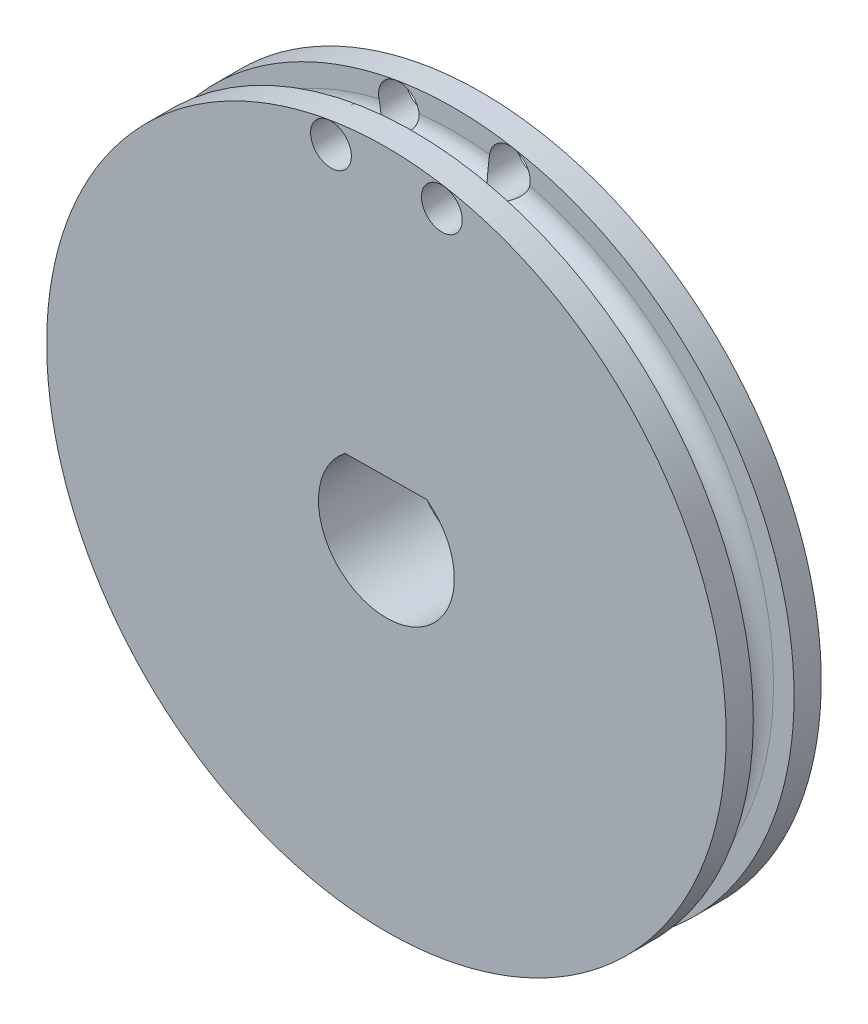
ISO-10303-21;
HEADER;
FILE_DESCRIPTION(('STEP AP214'),'2;1');
FILE_NAME('part.step','',(''),(''),'','','');
FILE_SCHEMA(('AUTOMOTIVE_DESIGN { 1 0 10303 214 1 1 1 1 }'));
ENDSEC;
DATA;
#1=APPLICATION_CONTEXT('core data for automotive mechanical design processes');
#2=APPLICATION_PROTOCOL_DEFINITION('international standard','automotive_design',2000,#1);
#3=PRODUCT_CONTEXT('',#1,'mechanical');
#4=PRODUCT('Part','Part','',(#3));
#5=PRODUCT_RELATED_PRODUCT_CATEGORY('part','',(#4));
#6=PRODUCT_DEFINITION_FORMATION('','',#4);
#7=PRODUCT_DEFINITION_CONTEXT('part definition',#1,'design');
#8=PRODUCT_DEFINITION('design','',#6,#7);
#9=PRODUCT_DEFINITION_SHAPE('','',#8);
#10=(LENGTH_UNIT() NAMED_UNIT(*) SI_UNIT(.MILLI.,.METRE.));
#11=(NAMED_UNIT(*) PLANE_ANGLE_UNIT() SI_UNIT($,.RADIAN.));
#12=(NAMED_UNIT(*) SI_UNIT($,.STERADIAN.) SOLID_ANGLE_UNIT());
#13=UNCERTAINTY_MEASURE_WITH_UNIT(LENGTH_MEASURE(1.E-05),#10,'distance_accuracy_value','');
#14=(GEOMETRIC_REPRESENTATION_CONTEXT(3) GLOBAL_UNCERTAINTY_ASSIGNED_CONTEXT((#13)) GLOBAL_UNIT_ASSIGNED_CONTEXT((#10,
#11,#12)) REPRESENTATION_CONTEXT('',''));
#15=CARTESIAN_POINT('',(0.,0.,0.));
#16=DIRECTION('',(0.,0.,1.));
#17=DIRECTION('',(1.,0.,0.));
#18=AXIS2_PLACEMENT_3D('',#15,#16,#17);
#19=CARTESIAN_POINT('',(0.,0.,0.072036914945138));
#20=DIRECTION('',(0.,0.,1.));
#21=DIRECTION('',(1.,0.,0.));
#22=AXIS2_PLACEMENT_3D('',#19,#20,#21);
#23=TOROIDAL_SURFACE('',#22,23.49,1.5);
#24=CARTESIAN_POINT('',(0.,0.,-1.42796308505486));
#25=DIRECTION('',(0.,0.,1.));
#26=DIRECTION('',(1.,0.,0.));
#27=AXIS2_PLACEMENT_3D('',#24,#25,#26);
#28=CIRCLE('',#27,23.49);
#29=CARTESIAN_POINT('',(-5.54713769197944,22.8256295296805,-1.42796308505486));
#30=VERTEX_POINT('',#29);
#31=CARTESIAN_POINT('',(5.54713769197964,22.8256295296813,-1.42796308505486));
#32=VERTEX_POINT('',#31);
#33=EDGE_CURVE('E109',#30,#32,#28,.T.);
#34=ORIENTED_EDGE('',*,*,#33,.T.);
#35=CARTESIAN_POINT('',(5.53587727955703,23.4902,-1.28282523331475));
#36=CARTESIAN_POINT('',(5.54296988954583,23.4612577675337,-1.29543508731334));
#37=CARTESIAN_POINT('',(5.54926513448115,23.4318414872527,-1.30739075382882));
#38=CARTESIAN_POINT('',(5.56014559001883,23.3721291733829,-1.3298635084857));
#39=CARTESIAN_POINT('',(5.56472940271165,23.34183244231,-1.34037941620202));
#40=CARTESIAN_POINT('',(5.57574755035601,23.2496067879141,-1.36960251723841));
#41=CARTESIAN_POINT('',(5.57940320750865,23.1865225117294,-1.38590534535933));
#42=CARTESIAN_POINT('',(5.57851359601544,23.0585896128547,-1.4109998918205));
#43=CARTESIAN_POINT('',(5.57392826223024,22.9937338883876,-1.41975460722039));
#44=CARTESIAN_POINT('',(5.55621707533469,22.8647342078331,-1.42882508482921));
#45=CARTESIAN_POINT('',(5.54311302305261,22.8005888587861,-1.42916230227391));
#46=CARTESIAN_POINT('',(5.50999335384375,22.6793411032209,-1.42158781258805));
#47=CARTESIAN_POINT('',(5.49050852649365,22.62205642535,-1.41423567121649));
#48=CARTESIAN_POINT('',(5.44535854027114,22.5113363926003,-1.39257744338744));
#49=CARTESIAN_POINT('',(5.41968752106894,22.4579047505302,-1.37826474986163));
#50=CARTESIAN_POINT('',(5.36267660035387,22.3548609879855,-1.34312765788525));
#51=CARTESIAN_POINT('',(5.33122514745139,22.3053577553524,-1.32216788666088));
#52=CARTESIAN_POINT('',(5.26426826944067,22.212029737362,-1.27489974194297));
#53=CARTESIAN_POINT('',(5.22876187285828,22.1682063181529,-1.24859008555276));
#54=CARTESIAN_POINT('',(5.13498252900141,22.0644641762039,-1.17641006770837));
#55=CARTESIAN_POINT('',(5.07466933075333,22.008431310042,-1.12759226735275));
#56=CARTESIAN_POINT('',(4.94984946741378,21.9092042260006,-1.02273167910773));
#57=CARTESIAN_POINT('',(4.88533179615433,21.8660455007917,-0.966669517309491));
#58=CARTESIAN_POINT('',(4.72690271071568,21.7760738682272,-0.825326797982623));
#59=CARTESIAN_POINT('',(4.63188124646892,21.7351465489062,-0.73755929116025));
#60=CARTESIAN_POINT('',(4.44079697214819,21.6739643568223,-0.556346515323248));
#61=CARTESIAN_POINT('',(4.34473341788815,21.6537253957179,-0.462896934592875));
#62=CARTESIAN_POINT('',(4.17727404012214,21.6346127931683,-0.29661562026875));
#63=CARTESIAN_POINT('',(4.10566591269968,21.6316868091401,-0.224414824434202));
#64=CARTESIAN_POINT('',(3.96368171012444,21.6358913289204,-0.0793042813436796));
#65=CARTESIAN_POINT('',(3.89330361838324,21.6430034211187,-0.00639607500957681));
#66=CARTESIAN_POINT('',(3.82206016996136,21.655302143156,0.0683257341572568));
#67=CARTESIAN_POINT('',(3.82029150239289,21.6556107342101,0.0701813419917548));
#68=CARTESIAN_POINT('',(3.81852342689566,21.6559224887385,0.072036914945138));
#69=B_SPLINE_CURVE_WITH_KNOTS('',3,(#35,#36,#37,#38,#39,#40,#41,#42,#43,#44,#45,#46,#47,#48,#49,
#50,#51,#52,#53,#54,#55,#56,#57,#58,#59,#60,#61,#62,#63,#64,#65,#66,#67,#68),.UNSPECIFIED.,.F.,
.F.,(4,2,2,2,2,2,2,2,2,2,2,2,2,2,2,2,4),(0.,0.097033725119664,0.194146535550287,
0.388972216130052,0.584747642266812,0.780024008226011,0.962016863528966,1.14418280756407,
1.33032676337095,1.51651540904874,1.80203315203328,2.08833091350429,2.49316653689112,
2.89831329035407,3.2030365612714,3.50720164150368,3.51494761423234),.UNSPECIFIED.);
#70=CARTESIAN_POINT('',(3.81852342689566,21.6559224887385,0.072036914945138));
#71=VERTEX_POINT('',#70);
#72=EDGE_CURVE('E172',#32,#71,#69,.T.);
#73=ORIENTED_EDGE('',*,*,#72,.T.);
#74=CARTESIAN_POINT('',(3.81852342689566,21.6559224887385,0.072036914945138));
#75=CARTESIAN_POINT('',(3.82029146213209,21.6556107471324,0.0738924446827287));
#76=CARTESIAN_POINT('',(3.82206012998036,21.6553021558237,0.0757480528489124));
#77=CARTESIAN_POINT('',(3.93867897884409,21.6351699203225,0.198060715299536));
#78=CARTESIAN_POINT('',(4.05616589076384,21.6286296876443,0.318811872192219));
#79=CARTESIAN_POINT('',(4.23378760420841,21.639959190087,0.497032114805131));
#80=CARTESIAN_POINT('',(4.29332098013085,21.647287108541,0.556044495245804));
#81=CARTESIAN_POINT('',(4.4124706036428,21.669419304703,0.672548366523577));
#82=CARTESIAN_POINT('',(4.47208677171208,21.6842186963164,0.730040825513147));
#83=CARTESIAN_POINT('',(4.60924884120185,21.7276127405149,0.860234267873168));
#84=CARTESIAN_POINT('',(4.68665808148888,21.759053296873,0.932161651550996));
#85=CARTESIAN_POINT('',(4.839019760022,21.8371149705561,1.07002745782826));
#86=CARTESIAN_POINT('',(4.91397733793056,21.8837017452553,1.13597900151308));
#87=CARTESIAN_POINT('',(5.04073635671208,21.9800040121342,1.24349169518864));
#88=CARTESIAN_POINT('',(5.09364544180589,22.0260320371978,1.28703054405928));
#89=CARTESIAN_POINT('',(5.19487390450964,22.1281636021159,1.36715517889373));
#90=CARTESIAN_POINT('',(5.24319905628782,22.1842542018695,1.40374977198521));
#91=CARTESIAN_POINT('',(5.32400149488492,22.2942955612163,1.46136067365825));
#92=CARTESIAN_POINT('',(5.35772062744923,22.3464619745528,1.48402731058987));
#93=CARTESIAN_POINT('',(5.41925222813132,22.4566124678633,1.52217863205728));
#94=CARTESIAN_POINT('',(5.44706867878494,22.514592586193,1.53766816738368));
#95=CARTESIAN_POINT('',(5.49552510641112,22.6354366175006,1.56048986189772));
#96=CARTESIAN_POINT('',(5.51612239825048,22.6983269766826,1.56777404733904));
#97=CARTESIAN_POINT('',(5.54884327577864,22.8266582527268,1.57349808433598));
#98=CARTESIAN_POINT('',(5.56096955890813,22.8920983506563,1.57194075275709));
#99=CARTESIAN_POINT('',(5.57570498397596,23.0171238078415,1.56079146625996));
#100=CARTESIAN_POINT('',(5.57909072791022,23.0766907897239,1.55195606402965));
#101=CARTESIAN_POINT('',(5.578896597277,23.1945139686135,1.52787218168111));
#102=CARTESIAN_POINT('',(5.57531409538923,23.2527696628328,1.51262128435198));
#103=CARTESIAN_POINT('',(5.56489513650583,23.3406901984014,1.4848430126624));
#104=CARTESIAN_POINT('',(5.56028913368249,23.371272539164,1.47424787242359));
#105=CARTESIAN_POINT('',(5.54934647475379,23.4314622950732,1.45161886659602));
#106=CARTESIAN_POINT('',(5.54301579855382,23.4610726898893,1.43959005154551));
#107=CARTESIAN_POINT('',(5.53587727955711,23.4902,1.42689906320502));
#108=B_SPLINE_CURVE_WITH_KNOTS('',3,(#74,#75,#76,#77,#78,#79,#80,#81,#82,#83,#84,#85,#86,#87,
#88,#89,#90,#91,#92,#93,#94,#95,#96,#97,#98,#99,#100,#101,#102,#103,#104,#105,#106,#107),
.UNSPECIFIED.,.F.,.F.,(4,2,2,2,2,2,2,2,2,2,2,2,2,2,2,2,4),(0.,0.0077459727286582,
0.510557627871253,0.762753922510325,1.01478550240646,1.34449093411415,1.67345394339158,
1.92025573776961,2.16674239993302,2.36431360073371,2.56175107352495,2.76033699657929,
2.95885965464949,3.13901836788079,3.3192450216535,3.41724080543281,3.51490104337425),.UNSPECIFIED.);
#109=CARTESIAN_POINT('',(5.54713769197951,22.8256295296805,1.57203691494514));
#110=VERTEX_POINT('',#109);
#111=EDGE_CURVE('E169',#71,#110,#108,.T.);
#112=ORIENTED_EDGE('',*,*,#111,.T.);
#113=CARTESIAN_POINT('',(0.,0.,1.57203691494514));
#114=DIRECTION('',(0.,0.,1.));
#115=DIRECTION('',(1.,0.,0.));
#116=AXIS2_PLACEMENT_3D('',#113,#114,#115);
#117=CIRCLE('',#116,23.49);
#118=CARTESIAN_POINT('',(-5.5471376919795,22.8256295296805,1.57203691494514));
#119=VERTEX_POINT('',#118);
#120=EDGE_CURVE('E110',#119,#110,#117,.T.);
#121=ORIENTED_EDGE('',*,*,#120,.F.);
#122=CARTESIAN_POINT('',(-5.53587727955702,23.4902,1.42689906320503));
#123=CARTESIAN_POINT('',(-5.54296988954582,23.4612577675337,1.43950891720362));
#124=CARTESIAN_POINT('',(-5.54926513448114,23.4318414872527,1.4514645837191));
#125=CARTESIAN_POINT('',(-5.56014559001882,23.3721291733829,1.47393733837598));
#126=CARTESIAN_POINT('',(-5.56472940271164,23.34183244231,1.4844532460923));
#127=CARTESIAN_POINT('',(-5.575747550356,23.2496067879141,1.51367634712869));
#128=CARTESIAN_POINT('',(-5.57940320750864,23.1865225117294,1.52997917524961));
#129=CARTESIAN_POINT('',(-5.57851359601543,23.0585896128547,1.55507372171077));
#130=CARTESIAN_POINT('',(-5.57392826223023,22.9937338883876,1.56382843711066));
#131=CARTESIAN_POINT('',(-5.55621707533468,22.8647342078331,1.57289891471948));
#132=CARTESIAN_POINT('',(-5.5431130230526,22.8005888587861,1.57323613216419));
#133=CARTESIAN_POINT('',(-5.50999335384374,22.6793411032209,1.56566164247833));
#134=CARTESIAN_POINT('',(-5.49050852649364,22.62205642535,1.55830950110677));
#135=CARTESIAN_POINT('',(-5.44535854027113,22.5113363926003,1.53665127327772));
#136=CARTESIAN_POINT('',(-5.41968752106893,22.4579047505302,1.52233857975191));
#137=CARTESIAN_POINT('',(-5.36267660035386,22.3548609879855,1.48720148777553));
#138=CARTESIAN_POINT('',(-5.33122514745138,22.3053577553524,1.46624171655115));
#139=CARTESIAN_POINT('',(-5.26426826944066,22.212029737362,1.41897357183324));
#140=CARTESIAN_POINT('',(-5.22876187285827,22.1682063181529,1.39266391544303));
#141=CARTESIAN_POINT('',(-5.1349825290014,22.0644641762039,1.32048389759864));
#142=CARTESIAN_POINT('',(-5.07466933075333,22.008431310042,1.27166609724301));
#143=CARTESIAN_POINT('',(-4.94984946741375,21.9092042260006,1.16680550899801));
#144=CARTESIAN_POINT('',(-4.88533179615428,21.8660455007917,1.11074334719979));
#145=CARTESIAN_POINT('',(-4.72690271071571,21.7760738682272,0.969400627872851));
#146=CARTESIAN_POINT('',(-4.63188124646913,21.7351465489061,0.881633121050319));
#147=CARTESIAN_POINT('',(-4.44079697214797,21.6739643568223,0.700420345213733));
#148=CARTESIAN_POINT('',(-4.34473341788733,21.653725395718,0.606970764483936));
#149=CARTESIAN_POINT('',(-4.17727404012271,21.6346127931682,0.440689450158441));
#150=CARTESIAN_POINT('',(-4.10566591270163,21.6316868091398,0.368488654322538));
#151=CARTESIAN_POINT('',(-3.96368171012245,21.6358913289207,0.223378111235897));
#152=CARTESIAN_POINT('',(-3.89330361837594,21.64300342112,0.150469904907019));
#153=CARTESIAN_POINT('',(-3.82206016996099,21.655302143156,0.0757480957333822));
#154=CARTESIAN_POINT('',(-3.8202915023927,21.6556107342101,0.0738924878987068));
#155=CARTESIAN_POINT('',(-3.81852342689565,21.6559224887385,0.072036914945138));
#156=B_SPLINE_CURVE_WITH_KNOTS('',3,(#122,#123,#124,#125,#126,#127,#128,#129,#130,#131,#132,
#133,#134,#135,#136,#137,#138,#139,#140,#141,#142,#143,#144,#145,#146,#147,#148,#149,#150,#151,
#152,#153,#154,#155),.UNSPECIFIED.,.F.,.F.,(4,2,2,2,2,2,2,2,2,2,2,2,2,2,2,2,4),(0.,
0.0970337251196675,0.194146535550291,0.388972216130052,0.584747642266805,0.780024008226011,
0.962016863528967,1.14418280756407,1.33032676337094,1.51651540904874,1.80203315203329,
2.0883309135043,2.4931665368911,2.89831329035408,3.2030365612714,3.50720164150367,
3.51494761423234),.UNSPECIFIED.);
#157=CARTESIAN_POINT('',(-3.81852342689565,21.6559224887385,0.072036914945138));
#158=VERTEX_POINT('',#157);
#159=EDGE_CURVE('E48',#119,#158,#156,.T.);
#160=ORIENTED_EDGE('',*,*,#159,.T.);
#161=CARTESIAN_POINT('',(-3.81852342689565,21.6559224887385,0.072036914945138));
#162=CARTESIAN_POINT('',(-3.82029146213221,21.6556107471324,0.0701813852076732));
#163=CARTESIAN_POINT('',(-3.82206012998061,21.6553021558237,0.068325777041612));
#164=CARTESIAN_POINT('',(-3.93867897885207,21.6351699203212,-0.0539868854008861));
#165=CARTESIAN_POINT('',(-4.05616589076479,21.6286296876441,-0.174738042299887));
#166=CARTESIAN_POINT('',(-4.23378760420664,21.639959190087,-0.352958284914605));
#167=CARTESIAN_POINT('',(-4.29332098012948,21.6472871085409,-0.41197066535459));
#168=CARTESIAN_POINT('',(-4.41247060364154,21.6694193047026,-0.52847453663169));
#169=CARTESIAN_POINT('',(-4.47208677171053,21.684218696316,-0.585966995621275));
#170=CARTESIAN_POINT('',(-4.60924884120018,21.7276127405143,-0.716160437981501));
#171=CARTESIAN_POINT('',(-4.68665808148744,21.7590532968724,-0.78808782165945));
#172=CARTESIAN_POINT('',(-4.83901976002095,21.8371149705555,-0.925953627937026));
#173=CARTESIAN_POINT('',(-4.91397733792967,21.8837017452547,-0.991905171622045));
#174=CARTESIAN_POINT('',(-5.04073635671138,21.9800040121336,-1.0994178652978));
#175=CARTESIAN_POINT('',(-5.09364544180522,22.0260320371972,-1.14295671416848));
#176=CARTESIAN_POINT('',(-5.19487390450904,22.1281636021152,-1.22308134900299));
#177=CARTESIAN_POINT('',(-5.24319905628725,22.1842542018688,-1.25967594209451));
#178=CARTESIAN_POINT('',(-5.32400149488442,22.2942955612156,-1.31728684376763));
#179=CARTESIAN_POINT('',(-5.35772062744876,22.3464619745521,-1.33995348069929));
#180=CARTESIAN_POINT('',(-5.41925222813093,22.4566124678626,-1.37810480216679));
#181=CARTESIAN_POINT('',(-5.44706867878459,22.5145925861923,-1.39359433749322));
#182=CARTESIAN_POINT('',(-5.49552510641085,22.6354366174999,-1.41641603200734));
#183=CARTESIAN_POINT('',(-5.51612239825025,22.6983269766818,-1.4237002174487));
#184=CARTESIAN_POINT('',(-5.54884327577848,22.8266582527261,-1.4294242544457));
#185=CARTESIAN_POINT('',(-5.56096955890802,22.8920983506556,-1.42786692286685));
#186=CARTESIAN_POINT('',(-5.5757049839759,23.0171238078408,-1.41671763636977));
#187=CARTESIAN_POINT('',(-5.57909072791019,23.0766907897233,-1.40788223413948));
#188=CARTESIAN_POINT('',(-5.57889659727701,23.1945139686129,-1.38379835179099));
#189=CARTESIAN_POINT('',(-5.57531409538927,23.2527696628322,-1.36854745446187));
#190=CARTESIAN_POINT('',(-5.5648951365059,23.3406901984009,-1.34076918277229));
#191=CARTESIAN_POINT('',(-5.56028913368254,23.3712725391636,-1.33017404253346));
#192=CARTESIAN_POINT('',(-5.54934647475383,23.431462295073,-1.30754503670582));
#193=CARTESIAN_POINT('',(-5.54301579855384,23.4610726898892,-1.29551622165528));
#194=CARTESIAN_POINT('',(-5.5358772795571,23.4902,-1.28282523331474));
#195=B_SPLINE_CURVE_WITH_KNOTS('',3,(#161,#162,#163,#164,#165,#166,#167,#168,#169,#170,#171,
#172,#173,#174,#175,#176,#177,#178,#179,#180,#181,#182,#183,#184,#185,#186,#187,#188,#189,#190,
#191,#192,#193,#194),.UNSPECIFIED.,.F.,.F.,(4,2,2,2,2,2,2,2,2,2,2,2,2,2,2,2,4),(0.,
0.00774597272865799,0.510557627870059,0.762753922508485,1.014785502404,1.34449093411236,
1.67345394339051,1.9202557377686,2.16674239993204,2.36431360073282,2.56175107352413,
2.76033699657855,2.95885965464883,3.13901836788014,3.31924502165287,3.41724080543249,
3.51490104337425),.UNSPECIFIED.);
#196=EDGE_CURVE('E106',#158,#30,#195,.T.);
#197=ORIENTED_EDGE('',*,*,#196,.T.);
#198=EDGE_LOOP('',(#34,#73,#112,#121,#160,#197));
#199=FACE_BOUND('',#198,.T.);
#200=ADVANCED_FACE('F33',(#199),#23,.F.);
#201=CARTESIAN_POINT('',(0.,0.,3.57203691494513));
#202=DIRECTION('',(0.,0.,-1.));
#203=DIRECTION('',(-1.,0.,0.));
#204=AXIS2_PLACEMENT_3D('',#201,#202,#203);
#205=PLANE('',#204);
#206=CARTESIAN_POINT('',(4.07899569339604,23.1331341182568,3.57203691494513));
#207=DIRECTION('',(0.,0.,-1.));
#208=DIRECTION('',(-1.,0.,0.));
#209=AXIS2_PLACEMENT_3D('',#206,#207,#208);
#210=CIRCLE('',#209,1.5);
#211=CARTESIAN_POINT('',(2.57899569339604,23.1331341182568,3.57203691494513));
#212=VERTEX_POINT('',#211);
#213=EDGE_CURVE('E205',#212,#212,#210,.T.);
#214=ORIENTED_EDGE('',*,*,#213,.T.);
#215=EDGE_LOOP('',(#214));
#216=FACE_BOUND('',#215,.T.);
#217=CARTESIAN_POINT('',(-4.07899569339603,23.1331341182568,3.57203691494513));
#218=DIRECTION('',(0.,0.,-1.));
#219=DIRECTION('',(-1.,0.,0.));
#220=AXIS2_PLACEMENT_3D('',#217,#218,#219);
#221=CIRCLE('',#220,1.5);
#222=CARTESIAN_POINT('',(-5.57899569339603,23.1331341182568,3.57203691494513));
#223=VERTEX_POINT('',#222);
#224=EDGE_CURVE('E174',#223,#223,#221,.T.);
#225=ORIENTED_EDGE('',*,*,#224,.T.);
#226=EDGE_LOOP('',(#225));
#227=FACE_BOUND('',#226,.T.);
#228=DIRECTION('',(0.999941658436289,0.0108018389028613,0.));
#229=VECTOR('',#228,1.);
#230=CARTESIAN_POINT('',(-0.0432073556114454,3.99976663374516,3.57203691494513));
#231=LINE('',#230,#229);
#232=CARTESIAN_POINT('',(-3.04303233092031,3.96736111703658,3.57203691494513));
#233=VERTEX_POINT('',#232);
#234=CARTESIAN_POINT('',(2.95661761969742,4.03217215045374,3.57203691494513));
#235=VERTEX_POINT('',#234);
#236=EDGE_CURVE('E216',#233,#235,#231,.T.);
#237=ORIENTED_EDGE('',*,*,#236,.T.);
#238=CARTESIAN_POINT('',(0.,0.,3.57203691494513));
#239=DIRECTION('',(0.,0.,-1.));
#240=DIRECTION('',(-1.,0.,0.));
#241=AXIS2_PLACEMENT_3D('',#238,#239,#240);
#242=CIRCLE('',#241,5.);
#243=EDGE_CURVE('E221',#235,#233,#242,.T.);
#244=ORIENTED_EDGE('',*,*,#243,.T.);
#245=EDGE_LOOP('',(#237,#244));
#246=FACE_BOUND('',#245,.T.);
#247=CARTESIAN_POINT('',(0.,0.,3.57203691494513));
#248=DIRECTION('',(0.,0.,1.));
#249=DIRECTION('',(1.,0.,0.));
#250=AXIS2_PLACEMENT_3D('',#247,#248,#249);
#251=CIRCLE('',#250,25.);
#252=CARTESIAN_POINT('',(25.,0.,3.57203691494513));
#253=VERTEX_POINT('',#252);
#254=EDGE_CURVE('E223',#253,#253,#251,.T.);
#255=ORIENTED_EDGE('',*,*,#254,.T.);
#256=EDGE_LOOP('',(#255));
#257=FACE_BOUND('',#256,.T.);
#258=ADVANCED_FACE('F35',(#216,#227,#246,#257),#205,.F.);
#259=CARTESIAN_POINT('',(0.,0.,-3.42796308505486));
#260=DIRECTION('',(0.,0.,1.));
#261=DIRECTION('',(1.,0.,0.));
#262=AXIS2_PLACEMENT_3D('',#259,#260,#261);
#263=PLANE('',#262);
#264=CARTESIAN_POINT('',(4.07899569339604,23.1331341182568,-3.42796308505486));
#265=DIRECTION('',(0.,0.,-1.));
#266=DIRECTION('',(-1.,0.,0.));
#267=AXIS2_PLACEMENT_3D('',#264,#265,#266);
#268=CIRCLE('',#267,1.5);
#269=CARTESIAN_POINT('',(2.57899569339604,23.1331341182568,-3.42796308505486));
#270=VERTEX_POINT('',#269);
#271=EDGE_CURVE('E265',#270,#270,#268,.T.);
#272=ORIENTED_EDGE('',*,*,#271,.F.);
#273=EDGE_LOOP('',(#272));
#274=FACE_BOUND('',#273,.T.);
#275=CARTESIAN_POINT('',(-4.07899569339603,23.1331341182568,-3.42796308505486));
#276=DIRECTION('',(0.,0.,-1.));
#277=DIRECTION('',(-1.,0.,0.));
#278=AXIS2_PLACEMENT_3D('',#275,#276,#277);
#279=CIRCLE('',#278,1.5);
#280=CARTESIAN_POINT('',(-5.57899569339603,23.1331341182568,-3.42796308505486));
#281=VERTEX_POINT('',#280);
#282=EDGE_CURVE('E262',#281,#281,#279,.T.);
#283=ORIENTED_EDGE('',*,*,#282,.F.);
#284=EDGE_LOOP('',(#283));
#285=FACE_BOUND('',#284,.T.);
#286=DIRECTION('',(0.999941658436289,0.0108018389028613,0.));
#287=VECTOR('',#286,1.);
#288=CARTESIAN_POINT('',(2.95661761969742,4.03217215045374,-3.42796308505486));
#289=LINE('',#288,#287);
#290=CARTESIAN_POINT('',(-3.04303233092031,3.96736111703658,-3.42796308505486));
#291=VERTEX_POINT('',#290);
#292=CARTESIAN_POINT('',(2.95661761969742,4.03217215045374,-3.42796308505486));
#293=VERTEX_POINT('',#292);
#294=EDGE_CURVE('E210',#291,#293,#289,.T.);
#295=ORIENTED_EDGE('',*,*,#294,.F.);
#296=CARTESIAN_POINT('',(0.,0.,-3.42796308505486));
#297=DIRECTION('',(0.,0.,-1.));
#298=DIRECTION('',(-1.,0.,0.));
#299=AXIS2_PLACEMENT_3D('',#296,#297,#298);
#300=CIRCLE('',#299,5.);
#301=EDGE_CURVE('E208',#293,#291,#300,.T.);
#302=ORIENTED_EDGE('',*,*,#301,.F.);
#303=EDGE_LOOP('',(#295,#302));
#304=FACE_BOUND('',#303,.T.);
#305=CARTESIAN_POINT('',(0.,0.,-3.42796308505486));
#306=DIRECTION('',(0.,0.,1.));
#307=DIRECTION('',(1.,0.,0.));
#308=AXIS2_PLACEMENT_3D('',#305,#306,#307);
#309=CIRCLE('',#308,25.);
#310=CARTESIAN_POINT('',(25.,0.,-3.42796308505486));
#311=VERTEX_POINT('',#310);
#312=EDGE_CURVE('E99',#311,#311,#309,.T.);
#313=ORIENTED_EDGE('',*,*,#312,.F.);
#314=EDGE_LOOP('',(#313));
#315=FACE_BOUND('',#314,.T.);
#316=ADVANCED_FACE('F127',(#274,#285,#304,#315),#263,.F.);
#317=CARTESIAN_POINT('',(0.,0.,3.57203691494513));
#318=DIRECTION('',(0.,0.,1.));
#319=DIRECTION('',(1.,0.,0.));
#320=AXIS2_PLACEMENT_3D('',#317,#318,#319);
#321=CYLINDRICAL_SURFACE('',#320,25.);
#322=CARTESIAN_POINT('',(0.,0.,-1.42796308505486));
#323=DIRECTION('',(0.,0.,1.));
#324=DIRECTION('',(1.,0.,0.));
#325=AXIS2_PLACEMENT_3D('',#322,#323,#324);
#326=CIRCLE('',#325,25.);
#327=CARTESIAN_POINT('',(25.,0.,-1.42796308505486));
#328=VERTEX_POINT('',#327);
#329=EDGE_CURVE('E119',#328,#328,#326,.T.);
#330=ORIENTED_EDGE('',*,*,#329,.F.);
#331=EDGE_LOOP('',(#330));
#332=FACE_BOUND('',#331,.T.);
#333=ORIENTED_EDGE('',*,*,#312,.T.);
#334=EDGE_LOOP('',(#333));
#335=FACE_BOUND('',#334,.T.);
#336=ADVANCED_FACE('F125',(#332,#335),#321,.T.);
#337=CARTESIAN_POINT('',(0.,23.49,-1.42796308505486));
#338=DIRECTION('',(0.,0.,-1.));
#339=DIRECTION('',(-1.,0.,0.));
#340=AXIS2_PLACEMENT_3D('',#337,#338,#339);
#341=PLANE('',#340);
#342=CARTESIAN_POINT('',(2.59422072760315,23.3463084622917,-1.42796308505486));
#343=VERTEX_POINT('',#342);
#344=CARTESIAN_POINT('',(-2.59422072760314,23.3463084622917,-1.42796308505486));
#345=VERTEX_POINT('',#344);
#346=EDGE_CURVE('E113',#343,#345,#28,.T.);
#347=ORIENTED_EDGE('',*,*,#346,.F.);
#348=CARTESIAN_POINT('',(4.07899569339604,23.1331341182568,-1.42796308505486));
#349=DIRECTION('',(0.,0.,-1.));
#350=DIRECTION('',(-1.,0.,0.));
#351=AXIS2_PLACEMENT_3D('',#348,#349,#350);
#352=CIRCLE('',#351,1.5);
#353=EDGE_CURVE('E164',#343,#32,#352,.T.);
#354=ORIENTED_EDGE('',*,*,#353,.T.);
#355=ORIENTED_EDGE('',*,*,#33,.F.);
#356=CARTESIAN_POINT('',(-4.07899569339603,23.1331341182568,-1.42796308505486));
#357=DIRECTION('',(0.,0.,-1.));
#358=DIRECTION('',(-1.,0.,0.));
#359=AXIS2_PLACEMENT_3D('',#356,#357,#358);
#360=CIRCLE('',#359,1.5);
#361=EDGE_CURVE('E165',#30,#345,#360,.T.);
#362=ORIENTED_EDGE('',*,*,#361,.T.);
#363=EDGE_LOOP('',(#347,#354,#355,#362));
#364=FACE_BOUND('',#363,.T.);
#365=ORIENTED_EDGE('',*,*,#329,.T.);
#366=EDGE_LOOP('',(#365));
#367=FACE_BOUND('',#366,.T.);
#368=ADVANCED_FACE('F134',(#364,#367),#341,.F.);
#369=CARTESIAN_POINT('',(2.62211410723505,23.4902,1.5649053964279));
#370=CARTESIAN_POINT('',(2.61455640634886,23.4593929494835,1.56799061938964));
#371=CARTESIAN_POINT('',(2.60796626580762,23.4282484290934,1.57008058271915));
#372=CARTESIAN_POINT('',(2.59676947387959,23.3655433476069,1.5722466225683));
#373=CARTESIAN_POINT('',(2.59216236234651,23.3339828847803,1.57232316653414));
#374=CARTESIAN_POINT('',(2.5849990782557,23.2708896385209,1.57044638422297));
#375=CARTESIAN_POINT('',(2.58243016840764,23.2393579331999,1.56850584230761));
#376=CARTESIAN_POINT('',(2.57928748618867,23.1763884680157,1.56264762909491));
#377=CARTESIAN_POINT('',(2.57871369031481,23.1449507070503,1.55872998108901));
#378=CARTESIAN_POINT('',(2.57993779174684,23.0511678782124,1.54409594114684));
#379=CARTESIAN_POINT('',(2.58467180974066,22.9892683507479,1.53049572056287));
#380=CARTESIAN_POINT('',(2.60127760476828,22.8683844608095,1.49646315395965));
#381=CARTESIAN_POINT('',(2.61315918194368,22.8094042214094,1.47602144456095));
#382=CARTESIAN_POINT('',(2.64749999818394,22.6785538912443,1.42249024675282));
#383=CARTESIAN_POINT('',(2.67204853722153,22.6080318470344,1.38744814077708));
#384=CARTESIAN_POINT('',(2.72925092827444,22.4747459044345,1.31004690526786));
#385=CARTESIAN_POINT('',(2.76191860790557,22.4119955178949,1.26767533081735));
#386=CARTESIAN_POINT('',(2.84747568193888,22.271433593207,1.15990231902865));
#387=CARTESIAN_POINT('',(2.90327497883626,22.197342553483,1.09197879293338));
#388=CARTESIAN_POINT('',(3.02325440696205,22.0637879169408,0.949383914962599));
#389=CARTESIAN_POINT('',(3.08745541349165,22.0043618554455,0.874695902961962));
#390=CARTESIAN_POINT('',(3.20462239943972,21.9126842820127,0.740721052740086));
#391=CARTESIAN_POINT('',(3.25628744793057,21.8773661651044,0.682354212608842));
#392=CARTESIAN_POINT('',(3.36220977137896,21.8140316447099,0.564015850140915));
#393=CARTESIAN_POINT('',(3.41646875957292,21.7860201481691,0.50404327908758));
#394=CARTESIAN_POINT('',(3.58207009803567,21.7127064283682,0.322894169977842));
#395=CARTESIAN_POINT('',(3.69658056730599,21.6778655394064,0.200093569678482));
#396=CARTESIAN_POINT('',(3.81498784825707,21.6565491902506,0.0757480513350116));
#397=CARTESIAN_POINT('',(3.81675539683208,21.6562342512039,0.0738924431649166));
#398=CARTESIAN_POINT('',(3.81852342689566,21.6559224887385,0.072036914945138));
#399=B_SPLINE_CURVE_WITH_KNOTS('',3,(#369,#370,#371,#372,#373,#374,#375,#376,#377,#378,#379,
#380,#381,#382,#383,#384,#385,#386,#387,#388,#389,#390,#391,#392,#393,#394,#395,#396,#397,#398),
.UNSPECIFIED.,.F.,.F.,(4,2,2,2,2,2,2,2,2,2,2,2,2,2,4),(0.,0.0955795102823252,0.19113683011877,
0.286092175710775,0.381046402700286,0.570701977935234,0.760618187789394,1.00671362215991,
1.25323108586571,1.5962532364655,1.94014445960825,2.196484421564,2.45299609442553,
2.96429287520986,2.97203884793851),.UNSPECIFIED.);
#400=CARTESIAN_POINT('',(2.5942207276031,23.3463084622917,1.57203691494514));
#401=VERTEX_POINT('',#400);
#402=EDGE_CURVE('E56',#401,#71,#399,.T.);
#403=ORIENTED_EDGE('',*,*,#402,.T.);
#404=CARTESIAN_POINT('',(3.81852342689566,21.6559224887385,0.072036914945138));
#405=CARTESIAN_POINT('',(3.81675539532537,21.6562342511152,0.0701813852115622));
#406=CARTESIAN_POINT('',(3.81498784675595,21.6565491901706,0.0683257770454815));
#407=CARTESIAN_POINT('',(3.69851327124989,21.6775176258306,-0.0539901132546467));
#408=CARTESIAN_POINT('',(3.58587181772842,21.7115559845888,-0.17474452987681));
#409=CARTESIAN_POINT('',(3.42283578268776,21.7829541685921,-0.352966210149972));
#410=CARTESIAN_POINT('',(3.36940052475955,21.8102013202891,-0.411976959683293));
#411=CARTESIAN_POINT('',(3.26500909029244,21.8717490971573,-0.528477629399756));
#412=CARTESIAN_POINT('',(3.21405131701975,21.9060451027941,-0.585968517928592));
#413=CARTESIAN_POINT('',(3.10000839682037,21.9937299729121,-0.71615552860388));
#414=CARTESIAN_POINT('',(3.03802475966957,22.0497456978802,-0.788078232497306));
#415=CARTESIAN_POINT('',(2.92154930894407,22.1752089007235,-0.925944841657226));
#416=CARTESIAN_POINT('',(2.86704189751473,22.2446276633094,-0.991901093835996));
#417=CARTESIAN_POINT('',(2.78085969944182,22.3784831115387,-1.0994198823992));
#418=CARTESIAN_POINT('',(2.74688247863867,22.4398333234392,-1.14296050855546));
#419=CARTESIAN_POINT('',(2.68669082891289,22.5704308591222,-1.22308461523411));
#420=CARTESIAN_POINT('',(2.66046587031307,22.6396672924301,-1.2596775082577));
#421=CARTESIAN_POINT('',(2.62216469052037,22.7707252229979,-1.31729902404641));
#422=CARTESIAN_POINT('',(2.60831502753956,22.8312999207685,-1.33997481733479));
#423=CARTESIAN_POINT('',(2.58817761685026,22.9558803626519,-1.37812024887697));
#424=CARTESIAN_POINT('',(2.58187753232445,23.0198803301932,-1.39360161816859));
#425=CARTESIAN_POINT('',(2.5786917900164,23.1182279670231,-1.4108588760944));
#426=CARTESIAN_POINT('',(2.57873112186402,23.1519905066556,-1.41564377679354));
#427=CARTESIAN_POINT('',(2.58111285510599,23.219691717877,-1.42293771050327));
#428=CARTESIAN_POINT('',(2.58345533447282,23.2536303953902,-1.42544666645677));
#429=CARTESIAN_POINT('',(2.5904918204818,23.3216363566582,-1.4281487652134));
#430=CARTESIAN_POINT('',(2.59520499547906,23.3557024049163,-1.42832270548343));
#431=CARTESIAN_POINT('',(2.60694050095698,23.4233767885727,-1.4263286980778));
#432=CARTESIAN_POINT('',(2.61396359631808,23.4569849685137,-1.42415997413517));
#433=CARTESIAN_POINT('',(2.62211410723505,23.4902,-1.42083156653763));
#434=B_SPLINE_CURVE_WITH_KNOTS('',3,(#404,#405,#406,#407,#408,#409,#410,#411,#412,#413,#414,
#415,#416,#417,#418,#419,#420,#421,#422,#423,#424,#425,#426,#427,#428,#429,#430,#431,#432,#433),
.UNSPECIFIED.,.F.,.F.,(4,2,2,2,2,2,2,2,2,2,2,2,2,2,4),(0.,0.00774597272865822,0.510571100539468,
0.762760660259789,1.0147854691313,1.34446900509668,1.67345389618221,1.92026652576347,
2.16674235993027,2.36440844233663,2.56175107485624,2.66392033784326,2.76609305986454,
2.86910551260881,2.97215211010986),.UNSPECIFIED.);
#435=EDGE_CURVE('E167',#71,#343,#434,.T.);
#436=ORIENTED_EDGE('',*,*,#435,.T.);
#437=ORIENTED_EDGE('',*,*,#346,.T.);
#438=CARTESIAN_POINT('',(-2.62211410723504,23.4902,-1.42083156653763));
#439=CARTESIAN_POINT('',(-2.61455661344222,23.4593937903465,-1.42391670449847));
#440=CARTESIAN_POINT('',(-2.60796662632144,23.4282501305058,-1.42600663817052));
#441=CARTESIAN_POINT('',(-2.5967700306543,23.3655467814591,-1.42817272963424));
#442=CARTESIAN_POINT('',(-2.59216296228597,23.3339871904551,-1.42824935454281));
#443=CARTESIAN_POINT('',(-2.58499945838842,23.2708939597525,-1.42637279241637));
#444=CARTESIAN_POINT('',(-2.58243039554518,23.2393613889583,-1.42443227937044));
#445=CARTESIAN_POINT('',(-2.57928751748875,23.176390192522,-1.41857401428778));
#446=CARTESIAN_POINT('',(-2.57871367875771,23.1449515657769,-1.41465628555726));
#447=CARTESIAN_POINT('',(-2.57993782892369,23.0511650832969,-1.40002167441134));
#448=CARTESIAN_POINT('',(-2.58467223657535,22.9892628096002,-1.38642067002588));
#449=CARTESIAN_POINT('',(-2.60127866747928,22.8683791725083,-1.35238749395236));
#450=CARTESIAN_POINT('',(-2.61315985346828,22.8094016641434,-1.33194656789517));
#451=CARTESIAN_POINT('',(-2.64749639174881,22.6785676310939,-1.27842203863585));
#452=CARTESIAN_POINT('',(-2.67203939529894,22.6080580940151,-1.2433873596966));
#453=CARTESIAN_POINT('',(-2.72923874835786,22.4747693143083,-1.16598887431011));
#454=CARTESIAN_POINT('',(-2.76191192373225,22.4120065121257,-1.12360992438025));
#455=CARTESIAN_POINT('',(-2.84751984133583,22.2713610258223,-1.01577285812917));
#456=CARTESIAN_POINT('',(-2.90337403147648,22.1972109524765,-0.947784362953545));
#457=CARTESIAN_POINT('',(-3.02336838226617,22.063682494053,-0.805177514163154));
#458=CARTESIAN_POINT('',(-3.08751481230124,22.0043153861096,-0.730554157696332));
#459=CARTESIAN_POINT('',(-3.2047219662721,21.9126063701894,-0.596533369700826));
#460=CARTESIAN_POINT('',(-3.25649326083942,21.8772254618838,-0.538047868900234));
#461=CARTESIAN_POINT('',(-3.36255624229787,21.8138422239165,-0.419557527500141));
#462=CARTESIAN_POINT('',(-3.41684574649405,21.7858336397304,-0.359554022430198));
#463=CARTESIAN_POINT('',(-3.58235225273989,21.7126207797452,-0.178517795304384));
#464=CARTESIAN_POINT('',(-3.6967239588646,21.6778397267664,-0.055869157295695));
#465=CARTESIAN_POINT('',(-3.81498784811715,21.6565491902527,0.0683257784127157));
#466=CARTESIAN_POINT('',(-3.81675539669132,21.6562342512055,0.0701813865820497));
#467=CARTESIAN_POINT('',(-3.81852342689565,21.6559224887385,0.072036914945138));
#468=B_SPLINE_CURVE_WITH_KNOTS('',3,(#438,#439,#440,#441,#442,#443,#444,#445,#446,#447,#448,
#449,#450,#451,#452,#453,#454,#455,#456,#457,#458,#459,#460,#461,#462,#463,#464,#465,#466,#467),
.UNSPECIFIED.,.F.,.F.,(4,2,2,2,2,2,2,2,2,2,2,2,2,2,4),(0.,0.0955769006025286,0.191131625778805,
0.286089573930423,0.381046402801493,0.570710451666117,0.760618184716033,1.0066678934617,
1.25323111444014,1.59655713109944,1.94014425595627,2.1969944308822,2.45362599201821,
2.9642942509645,2.97204022369316),.UNSPECIFIED.);
#469=EDGE_CURVE('E105',#345,#158,#468,.T.);
#470=ORIENTED_EDGE('',*,*,#469,.T.);
#471=CARTESIAN_POINT('',(-3.81852342689565,21.6559224887385,0.072036914945138));
#472=CARTESIAN_POINT('',(-3.81675539532543,21.6562342511152,0.0738924446787816));
#473=CARTESIAN_POINT('',(-3.81498784675608,21.6565491901706,0.0757480528449283));
#474=CARTESIAN_POINT('',(-3.69851327125417,21.6775176258299,0.198063943149436));
#475=CARTESIAN_POINT('',(-3.58587181772894,21.7115559845887,0.318818359768209));
#476=CARTESIAN_POINT('',(-3.42283578268685,21.7829541685924,0.497040040040401));
#477=CARTESIAN_POINT('',(-3.36940052475887,21.8102013202894,0.556050789574088));
#478=CARTESIAN_POINT('',(-3.26500909029187,21.8717490971577,0.672551459290905));
#479=CARTESIAN_POINT('',(-3.21405131701904,21.9060451027946,0.73004234781973));
#480=CARTESIAN_POINT('',(-3.10000839681963,21.9937299729127,0.860229358494903));
#481=CARTESIAN_POINT('',(-3.03802475966896,22.0497456978808,0.932152062388263));
#482=CARTESIAN_POINT('',(-2.92154930894366,22.175208900724,1.07001867154802));
#483=CARTESIAN_POINT('',(-2.86704189751439,22.2446276633099,1.13597492372669));
#484=CARTESIAN_POINT('',(-2.78085969944157,22.3784831115391,1.24349371228978));
#485=CARTESIAN_POINT('',(-2.74688247863844,22.4398333234397,1.28703433844602));
#486=CARTESIAN_POINT('',(-2.6866908289127,22.5704308591226,1.36715844512463));
#487=CARTESIAN_POINT('',(-2.6604658703129,22.6396672924306,1.4037513381482));
#488=CARTESIAN_POINT('',(-2.62216469052024,22.7707252229984,1.46137285393687));
#489=CARTESIAN_POINT('',(-2.60831502753945,22.8312999207689,1.48404864722523));
#490=CARTESIAN_POINT('',(-2.5881776168502,22.9558803626523,1.52219407876737));
#491=CARTESIAN_POINT('',(-2.58187753232441,23.0198803301937,1.53767544805896));
#492=CARTESIAN_POINT('',(-2.57869179001638,23.1182279670235,1.55493270598473));
#493=CARTESIAN_POINT('',(-2.57873112186402,23.151990506656,1.55971760668387));
#494=CARTESIAN_POINT('',(-2.581112855106,23.2196917178773,1.56701154039357));
#495=CARTESIAN_POINT('',(-2.58345533447283,23.2536303953905,1.56952049634707));
#496=CARTESIAN_POINT('',(-2.59049182048182,23.3216363566583,1.57222259510368));
#497=CARTESIAN_POINT('',(-2.59520499547908,23.3557024049164,1.57239653537371));
#498=CARTESIAN_POINT('',(-2.60694050095698,23.4233767885728,1.57040252796807));
#499=CARTESIAN_POINT('',(-2.61396359631808,23.4569849685137,1.56823380402544));
#500=CARTESIAN_POINT('',(-2.62211410723504,23.4902,1.5649053964279));
#501=B_SPLINE_CURVE_WITH_KNOTS('',3,(#471,#472,#473,#474,#475,#476,#477,#478,#479,#480,#481,
#482,#483,#484,#485,#486,#487,#488,#489,#490,#491,#492,#493,#494,#495,#496,#497,#498,#499,#500),
.UNSPECIFIED.,.F.,.F.,(4,2,2,2,2,2,2,2,2,2,2,2,2,2,4),(0.,0.0077459727286585,0.510571100540133,
0.762760660260783,1.01478546913262,1.34446900509762,1.67345389618278,1.92026652576402,
2.16674235993079,2.36440844233711,2.56175107485668,2.66392033784359,2.76609305986477,
2.86910551260892,2.97215211010986),.UNSPECIFIED.);
#502=CARTESIAN_POINT('',(-2.59422072760309,23.3463084622917,1.57203691494514));
#503=VERTEX_POINT('',#502);
#504=EDGE_CURVE('E93',#158,#503,#501,.T.);
#505=ORIENTED_EDGE('',*,*,#504,.T.);
#506=EDGE_CURVE('E103',#401,#503,#117,.T.);
#507=ORIENTED_EDGE('',*,*,#506,.F.);
#508=EDGE_LOOP('',(#403,#436,#437,#470,#505,#507));
#509=FACE_BOUND('',#508,.T.);
#510=ADVANCED_FACE('F102',(#509),#23,.F.);
#511=CARTESIAN_POINT('',(0.,25.,1.57203691494514));
#512=DIRECTION('',(0.,0.,1.));
#513=DIRECTION('',(1.,0.,0.));
#514=AXIS2_PLACEMENT_3D('',#511,#512,#513);
#515=PLANE('',#514);
#516=CARTESIAN_POINT('',(0.,0.,1.57203691494514));
#517=DIRECTION('',(0.,0.,1.));
#518=DIRECTION('',(1.,0.,0.));
#519=AXIS2_PLACEMENT_3D('',#516,#517,#518);
#520=CIRCLE('',#519,25.);
#521=CARTESIAN_POINT('',(25.,0.,1.57203691494514));
#522=VERTEX_POINT('',#521);
#523=EDGE_CURVE('E115',#522,#522,#520,.T.);
#524=ORIENTED_EDGE('',*,*,#523,.F.);
#525=EDGE_LOOP('',(#524));
#526=FACE_BOUND('',#525,.T.);
#527=ORIENTED_EDGE('',*,*,#120,.T.);
#528=CARTESIAN_POINT('',(4.07899569339604,23.1331341182568,1.57203691494514));
#529=DIRECTION('',(0.,0.,1.));
#530=DIRECTION('',(1.,0.,0.));
#531=AXIS2_PLACEMENT_3D('',#528,#529,#530);
#532=CIRCLE('',#531,1.5);
#533=EDGE_CURVE('E11',#110,#401,#532,.T.);
#534=ORIENTED_EDGE('',*,*,#533,.T.);
#535=ORIENTED_EDGE('',*,*,#506,.T.);
#536=CARTESIAN_POINT('',(-4.07899569339603,23.1331341182568,1.57203691494514));
#537=DIRECTION('',(0.,0.,1.));
#538=DIRECTION('',(1.,0.,0.));
#539=AXIS2_PLACEMENT_3D('',#536,#537,#538);
#540=CIRCLE('',#539,1.5);
#541=EDGE_CURVE('E41',#503,#119,#540,.T.);
#542=ORIENTED_EDGE('',*,*,#541,.T.);
#543=EDGE_LOOP('',(#527,#534,#535,#542));
#544=FACE_BOUND('',#543,.T.);
#545=ADVANCED_FACE('F108',(#526,#544),#515,.F.);
#546=CARTESIAN_POINT('',(0.,0.,3.57203691494513));
#547=DIRECTION('',(0.,0.,1.));
#548=DIRECTION('',(1.,0.,0.));
#549=AXIS2_PLACEMENT_3D('',#546,#547,#548);
#550=CYLINDRICAL_SURFACE('',#549,25.);
#551=ORIENTED_EDGE('',*,*,#254,.F.);
#552=EDGE_LOOP('',(#551));
#553=FACE_BOUND('',#552,.T.);
#554=ORIENTED_EDGE('',*,*,#523,.T.);
#555=EDGE_LOOP('',(#554));
#556=FACE_BOUND('',#555,.T.);
#557=ADVANCED_FACE('F153',(#553,#556),#550,.T.);
#558=CARTESIAN_POINT('',(0.,0.,5.57203691494514));
#559=DIRECTION('',(0.,0.,-1.));
#560=DIRECTION('',(-1.,0.,0.));
#561=AXIS2_PLACEMENT_3D('',#558,#559,#560);
#562=CYLINDRICAL_SURFACE('',#561,5.);
#563=DIRECTION('',(0.,0.,-1.));
#564=VECTOR('',#563,1.);
#565=CARTESIAN_POINT('',(2.95661761969742,4.03217215045374,5.57203691494514));
#566=LINE('',#565,#564);
#567=EDGE_CURVE('E214',#235,#293,#566,.T.);
#568=ORIENTED_EDGE('',*,*,#567,.T.);
#569=ORIENTED_EDGE('',*,*,#301,.T.);
#570=DIRECTION('',(0.,0.,-1.));
#571=VECTOR('',#570,1.);
#572=CARTESIAN_POINT('',(-3.04303233092031,3.96736111703658,5.57203691494514));
#573=LINE('',#572,#571);
#574=EDGE_CURVE('E213',#233,#291,#573,.T.);
#575=ORIENTED_EDGE('',*,*,#574,.F.);
#576=ORIENTED_EDGE('',*,*,#243,.F.);
#577=EDGE_LOOP('',(#568,#569,#575,#576));
#578=FACE_BOUND('',#577,.T.);
#579=ADVANCED_FACE('F231',(#578),#562,.F.);
#580=CARTESIAN_POINT('',(2.95661761969742,4.03217215045374,5.57203691494514));
#581=DIRECTION('',(-0.0108018389028613,0.999941658436289,0.));
#582=DIRECTION('',(-0.999941658436289,-0.0108018389028613,0.));
#583=AXIS2_PLACEMENT_3D('',#580,#581,#582);
#584=PLANE('',#583);
#585=ORIENTED_EDGE('',*,*,#574,.T.);
#586=ORIENTED_EDGE('',*,*,#294,.T.);
#587=ORIENTED_EDGE('',*,*,#567,.F.);
#588=ORIENTED_EDGE('',*,*,#236,.F.);
#589=EDGE_LOOP('',(#585,#586,#587,#588));
#590=FACE_BOUND('',#589,.T.);
#591=ADVANCED_FACE('F237',(#590),#584,.F.);
#592=CARTESIAN_POINT('',(-4.07899569339603,23.1331341182568,30.0620369149451));
#593=DIRECTION('',(0.,0.,-1.));
#594=DIRECTION('',(-1.,0.,0.));
#595=AXIS2_PLACEMENT_3D('',#592,#593,#594);
#596=CYLINDRICAL_SURFACE('',#595,1.5);
#597=ORIENTED_EDGE('',*,*,#159,.F.);
#598=ORIENTED_EDGE('',*,*,#541,.F.);
#599=ORIENTED_EDGE('',*,*,#504,.F.);
#600=EDGE_LOOP('',(#597,#598,#599));
#601=FACE_BOUND('',#600,.T.);
#602=ORIENTED_EDGE('',*,*,#224,.F.);
#603=EDGE_LOOP('',(#602));
#604=FACE_BOUND('',#603,.T.);
#605=ADVANCED_FACE('F91',(#601,#604),#596,.F.);
#606=CARTESIAN_POINT('',(4.07899569339604,23.1331341182568,30.0620369149451));
#607=DIRECTION('',(0.,0.,-1.));
#608=DIRECTION('',(-1.,0.,0.));
#609=AXIS2_PLACEMENT_3D('',#606,#607,#608);
#610=CYLINDRICAL_SURFACE('',#609,1.5);
#611=ORIENTED_EDGE('',*,*,#402,.F.);
#612=ORIENTED_EDGE('',*,*,#533,.F.);
#613=ORIENTED_EDGE('',*,*,#111,.F.);
#614=EDGE_LOOP('',(#611,#612,#613));
#615=FACE_BOUND('',#614,.T.);
#616=ORIENTED_EDGE('',*,*,#213,.F.);
#617=EDGE_LOOP('',(#616));
#618=FACE_BOUND('',#617,.T.);
#619=ADVANCED_FACE('F188',(#615,#618),#610,.F.);
#620=ORIENTED_EDGE('',*,*,#282,.T.);
#621=EDGE_LOOP('',(#620));
#622=FACE_BOUND('',#621,.T.);
#623=ORIENTED_EDGE('',*,*,#196,.F.);
#624=ORIENTED_EDGE('',*,*,#469,.F.);
#625=ORIENTED_EDGE('',*,*,#361,.F.);
#626=EDGE_LOOP('',(#623,#624,#625));
#627=FACE_BOUND('',#626,.T.);
#628=ADVANCED_FACE('F192',(#622,#627),#596,.F.);
#629=ORIENTED_EDGE('',*,*,#271,.T.);
#630=EDGE_LOOP('',(#629));
#631=FACE_BOUND('',#630,.T.);
#632=ORIENTED_EDGE('',*,*,#435,.F.);
#633=ORIENTED_EDGE('',*,*,#72,.F.);
#634=ORIENTED_EDGE('',*,*,#353,.F.);
#635=EDGE_LOOP('',(#632,#633,#634));
#636=FACE_BOUND('',#635,.T.);
#637=ADVANCED_FACE('F193',(#631,#636),#610,.F.);
#638=CLOSED_SHELL('',(#200,#258,#316,#336,#368,#510,#545,#557,#579,#591,#605,#619,#628,#637));
#639=MANIFOLD_SOLID_BREP('B2',#638);
#640=ADVANCED_BREP_SHAPE_REPRESENTATION('',(#18,#639),#14);
#641=SHAPE_DEFINITION_REPRESENTATION(#9,#640);
ENDSEC;
END-ISO-10303-21;
